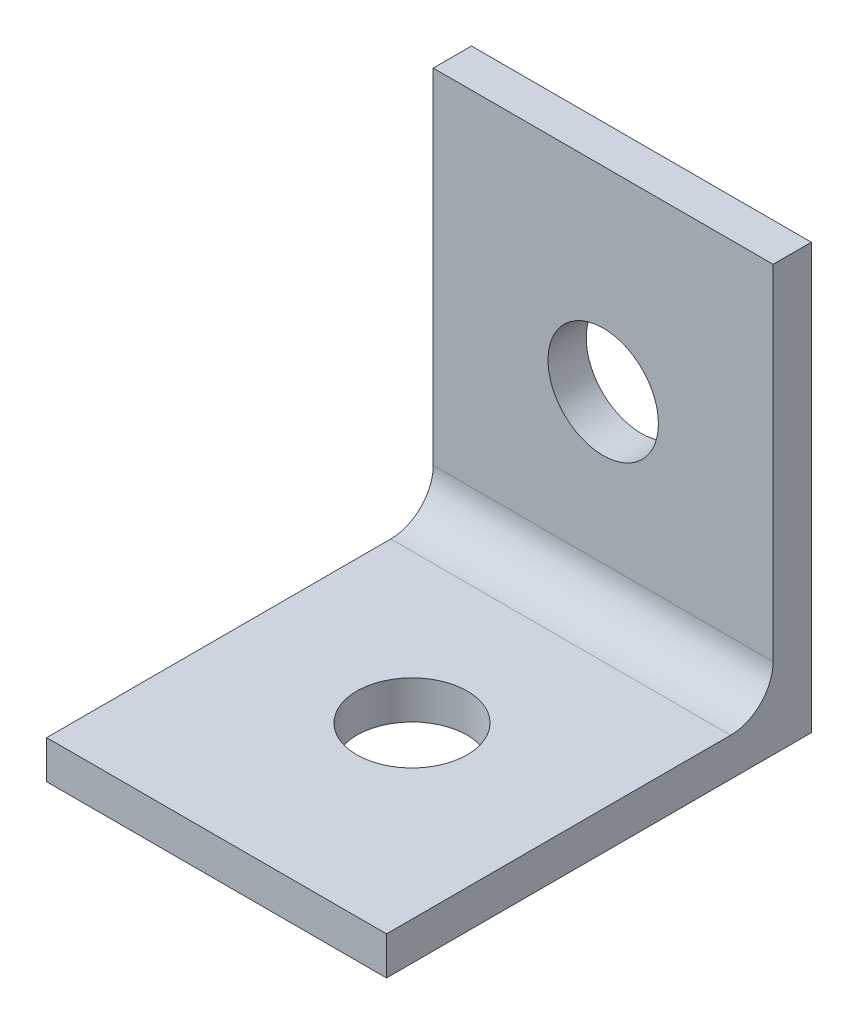
ISO-10303-21;
HEADER;
FILE_DESCRIPTION(('STEP AP214'),'2;1');
FILE_NAME('part.step','',(''),(''),'','','');
FILE_SCHEMA(('AUTOMOTIVE_DESIGN { 1 0 10303 214 1 1 1 1 }'));
ENDSEC;
DATA;
#1=APPLICATION_CONTEXT('core data for automotive mechanical design processes');
#2=APPLICATION_PROTOCOL_DEFINITION('international standard','automotive_design',2000,#1);
#3=PRODUCT_CONTEXT('',#1,'mechanical');
#4=PRODUCT('Part','Part','',(#3));
#5=PRODUCT_RELATED_PRODUCT_CATEGORY('part','',(#4));
#6=PRODUCT_DEFINITION_FORMATION('','',#4);
#7=PRODUCT_DEFINITION_CONTEXT('part definition',#1,'design');
#8=PRODUCT_DEFINITION('design','',#6,#7);
#9=PRODUCT_DEFINITION_SHAPE('','',#8);
#10=(LENGTH_UNIT() NAMED_UNIT(*) SI_UNIT(.MILLI.,.METRE.));
#11=(NAMED_UNIT(*) PLANE_ANGLE_UNIT() SI_UNIT($,.RADIAN.));
#12=(NAMED_UNIT(*) SI_UNIT($,.STERADIAN.) SOLID_ANGLE_UNIT());
#13=UNCERTAINTY_MEASURE_WITH_UNIT(LENGTH_MEASURE(1.E-05),#10,'distance_accuracy_value','');
#14=(GEOMETRIC_REPRESENTATION_CONTEXT(3) GLOBAL_UNCERTAINTY_ASSIGNED_CONTEXT((#13)) GLOBAL_UNIT_ASSIGNED_CONTEXT((#10,
#11,#12)) REPRESENTATION_CONTEXT('',''));
#15=CARTESIAN_POINT('',(0.,0.,0.));
#16=DIRECTION('',(0.,0.,1.));
#17=DIRECTION('',(1.,0.,0.));
#18=AXIS2_PLACEMENT_3D('',#15,#16,#17);
#19=CARTESIAN_POINT('',(0.,0.,1.8));
#20=DIRECTION('',(1.,0.,0.));
#21=DIRECTION('',(0.,0.,-1.));
#22=AXIS2_PLACEMENT_3D('',#19,#20,#21);
#23=PLANE('',#22);
#24=DIRECTION('',(0.,-1.,0.));
#25=VECTOR('',#24,1.);
#26=CARTESIAN_POINT('',(0.,0.,0.));
#27=LINE('',#26,#25);
#28=CARTESIAN_POINT('',(0.,20.,0.));
#29=VERTEX_POINT('',#28);
#30=CARTESIAN_POINT('',(0.,0.,0.));
#31=VERTEX_POINT('',#30);
#32=EDGE_CURVE('E131',#29,#31,#27,.T.);
#33=ORIENTED_EDGE('',*,*,#32,.T.);
#34=DIRECTION('',(0.,0.,-1.));
#35=VECTOR('',#34,1.);
#36=CARTESIAN_POINT('',(0.,0.,1.8));
#37=LINE('',#36,#35);
#38=CARTESIAN_POINT('',(0.,0.,20.));
#39=VERTEX_POINT('',#38);
#40=EDGE_CURVE('E166',#39,#31,#37,.T.);
#41=ORIENTED_EDGE('',*,*,#40,.F.);
#42=DIRECTION('',(0.,-1.,0.));
#43=VECTOR('',#42,1.);
#44=CARTESIAN_POINT('',(0.,1.8,20.));
#45=LINE('',#44,#43);
#46=CARTESIAN_POINT('',(0.,1.8,20.));
#47=VERTEX_POINT('',#46);
#48=EDGE_CURVE('E120',#47,#39,#45,.T.);
#49=ORIENTED_EDGE('',*,*,#48,.F.);
#50=DIRECTION('',(0.,0.,-1.));
#51=VECTOR('',#50,1.);
#52=CARTESIAN_POINT('',(0.,1.8,1.8));
#53=LINE('',#52,#51);
#54=CARTESIAN_POINT('',(0.,1.8,3.8));
#55=VERTEX_POINT('',#54);
#56=EDGE_CURVE('E111',#47,#55,#53,.T.);
#57=ORIENTED_EDGE('',*,*,#56,.T.);
#58=CARTESIAN_POINT('',(0.,3.8,3.8));
#59=DIRECTION('',(1.,0.,0.));
#60=DIRECTION('',(0.,0.,-1.));
#61=AXIS2_PLACEMENT_3D('',#58,#59,#60);
#62=CIRCLE('',#61,2.);
#63=CARTESIAN_POINT('',(0.,3.8,1.8));
#64=VERTEX_POINT('',#63);
#65=EDGE_CURVE('E11',#55,#64,#62,.T.);
#66=ORIENTED_EDGE('',*,*,#65,.T.);
#67=DIRECTION('',(0.,-1.,0.));
#68=VECTOR('',#67,1.);
#69=CARTESIAN_POINT('',(0.,0.,1.8));
#70=LINE('',#69,#68);
#71=CARTESIAN_POINT('',(0.,20.,1.8));
#72=VERTEX_POINT('',#71);
#73=EDGE_CURVE('E133',#72,#64,#70,.T.);
#74=ORIENTED_EDGE('',*,*,#73,.F.);
#75=DIRECTION('',(0.,0.,-1.));
#76=VECTOR('',#75,1.);
#77=CARTESIAN_POINT('',(0.,20.,1.8));
#78=LINE('',#77,#76);
#79=EDGE_CURVE('E144',#72,#29,#78,.T.);
#80=ORIENTED_EDGE('',*,*,#79,.T.);
#81=EDGE_LOOP('',(#33,#41,#49,#57,#66,#74,#80));
#82=FACE_BOUND('',#81,.T.);
#83=ADVANCED_FACE('F45',(#82),#23,.F.);
#84=CARTESIAN_POINT('',(0.,0.,1.8));
#85=DIRECTION('',(0.,1.,0.));
#86=DIRECTION('',(0.,0.,1.));
#87=AXIS2_PLACEMENT_3D('',#84,#85,#86);
#88=PLANE('',#87);
#89=CARTESIAN_POINT('',(8.,0.,10.8));
#90=DIRECTION('',(0.,1.,0.));
#91=DIRECTION('',(0.,0.,1.));
#92=AXIS2_PLACEMENT_3D('',#89,#90,#91);
#93=CIRCLE('',#92,2.6);
#94=CARTESIAN_POINT('',(8.,0.,13.4));
#95=VERTEX_POINT('',#94);
#96=EDGE_CURVE('E234',#95,#95,#93,.T.);
#97=ORIENTED_EDGE('',*,*,#96,.T.);
#98=EDGE_LOOP('',(#97));
#99=FACE_BOUND('',#98,.T.);
#100=DIRECTION('',(1.,0.,0.));
#101=VECTOR('',#100,1.);
#102=CARTESIAN_POINT('',(0.,0.,0.));
#103=LINE('',#102,#101);
#104=CARTESIAN_POINT('',(16.,0.,0.));
#105=VERTEX_POINT('',#104);
#106=EDGE_CURVE('E148',#31,#105,#103,.T.);
#107=ORIENTED_EDGE('',*,*,#106,.T.);
#108=DIRECTION('',(0.,0.,-1.));
#109=VECTOR('',#108,1.);
#110=CARTESIAN_POINT('',(16.,0.,1.8));
#111=LINE('',#110,#109);
#112=CARTESIAN_POINT('',(16.,0.,20.));
#113=VERTEX_POINT('',#112);
#114=EDGE_CURVE('E163',#113,#105,#111,.T.);
#115=ORIENTED_EDGE('',*,*,#114,.F.);
#116=DIRECTION('',(-1.,0.,0.));
#117=VECTOR('',#116,1.);
#118=CARTESIAN_POINT('',(0.,0.,20.));
#119=LINE('',#118,#117);
#120=EDGE_CURVE('E118',#113,#39,#119,.T.);
#121=ORIENTED_EDGE('',*,*,#120,.T.);
#122=ORIENTED_EDGE('',*,*,#40,.T.);
#123=EDGE_LOOP('',(#107,#115,#121,#122));
#124=FACE_BOUND('',#123,.T.);
#125=ADVANCED_FACE('F201',(#99,#124),#88,.F.);
#126=CARTESIAN_POINT('',(16.,0.,1.8));
#127=DIRECTION('',(-1.,0.,0.));
#128=DIRECTION('',(0.,0.,1.));
#129=AXIS2_PLACEMENT_3D('',#126,#127,#128);
#130=PLANE('',#129);
#131=DIRECTION('',(0.,1.,0.));
#132=VECTOR('',#131,1.);
#133=CARTESIAN_POINT('',(16.,0.,0.));
#134=LINE('',#133,#132);
#135=CARTESIAN_POINT('',(16.,20.,0.));
#136=VERTEX_POINT('',#135);
#137=EDGE_CURVE('E151',#105,#136,#134,.T.);
#138=ORIENTED_EDGE('',*,*,#137,.T.);
#139=DIRECTION('',(0.,0.,-1.));
#140=VECTOR('',#139,1.);
#141=CARTESIAN_POINT('',(16.,20.,1.8));
#142=LINE('',#141,#140);
#143=CARTESIAN_POINT('',(16.,20.,1.8));
#144=VERTEX_POINT('',#143);
#145=EDGE_CURVE('E159',#144,#136,#142,.T.);
#146=ORIENTED_EDGE('',*,*,#145,.F.);
#147=DIRECTION('',(0.,1.,0.));
#148=VECTOR('',#147,1.);
#149=CARTESIAN_POINT('',(16.,0.,1.8));
#150=LINE('',#149,#148);
#151=CARTESIAN_POINT('',(16.,3.8,1.8));
#152=VERTEX_POINT('',#151);
#153=EDGE_CURVE('E137',#152,#144,#150,.T.);
#154=ORIENTED_EDGE('',*,*,#153,.F.);
#155=CARTESIAN_POINT('',(16.,3.8,3.8));
#156=DIRECTION('',(-1.,0.,0.));
#157=DIRECTION('',(0.,0.,1.));
#158=AXIS2_PLACEMENT_3D('',#155,#156,#157);
#159=CIRCLE('',#158,2.);
#160=CARTESIAN_POINT('',(16.,1.8,3.8));
#161=VERTEX_POINT('',#160);
#162=EDGE_CURVE('E54',#152,#161,#159,.T.);
#163=ORIENTED_EDGE('',*,*,#162,.T.);
#164=DIRECTION('',(0.,0.,1.));
#165=VECTOR('',#164,1.);
#166=CARTESIAN_POINT('',(16.,1.8,1.8));
#167=LINE('',#166,#165);
#168=CARTESIAN_POINT('',(16.,1.8,20.));
#169=VERTEX_POINT('',#168);
#170=EDGE_CURVE('E102',#161,#169,#167,.T.);
#171=ORIENTED_EDGE('',*,*,#170,.T.);
#172=DIRECTION('',(0.,-1.,0.));
#173=VECTOR('',#172,1.);
#174=CARTESIAN_POINT('',(16.,1.8,20.));
#175=LINE('',#174,#173);
#176=EDGE_CURVE('E106',#169,#113,#175,.T.);
#177=ORIENTED_EDGE('',*,*,#176,.T.);
#178=ORIENTED_EDGE('',*,*,#114,.T.);
#179=EDGE_LOOP('',(#138,#146,#154,#163,#171,#177,#178));
#180=FACE_BOUND('',#179,.T.);
#181=ADVANCED_FACE('F104',(#180),#130,.F.);
#182=CARTESIAN_POINT('',(0.,20.,1.8));
#183=DIRECTION('',(0.,-1.,0.));
#184=DIRECTION('',(0.,0.,-1.));
#185=AXIS2_PLACEMENT_3D('',#182,#183,#184);
#186=PLANE('',#185);
#187=DIRECTION('',(-1.,0.,0.));
#188=VECTOR('',#187,1.);
#189=CARTESIAN_POINT('',(0.,20.,0.));
#190=LINE('',#189,#188);
#191=EDGE_CURVE('E138',#136,#29,#190,.T.);
#192=ORIENTED_EDGE('',*,*,#191,.T.);
#193=ORIENTED_EDGE('',*,*,#79,.F.);
#194=DIRECTION('',(-1.,0.,0.));
#195=VECTOR('',#194,1.);
#196=CARTESIAN_POINT('',(0.,20.,1.8));
#197=LINE('',#196,#195);
#198=EDGE_CURVE('E141',#144,#72,#197,.T.);
#199=ORIENTED_EDGE('',*,*,#198,.F.);
#200=ORIENTED_EDGE('',*,*,#145,.T.);
#201=EDGE_LOOP('',(#192,#193,#199,#200));
#202=FACE_BOUND('',#201,.T.);
#203=ADVANCED_FACE('F188',(#202),#186,.F.);
#204=CARTESIAN_POINT('',(0.,0.,1.8));
#205=DIRECTION('',(0.,0.,-1.));
#206=DIRECTION('',(-1.,0.,0.));
#207=AXIS2_PLACEMENT_3D('',#204,#205,#206);
#208=PLANE('',#207);
#209=CARTESIAN_POINT('',(8.,10.8,1.8));
#210=DIRECTION('',(0.,0.,1.));
#211=DIRECTION('',(1.,0.,0.));
#212=AXIS2_PLACEMENT_3D('',#209,#210,#211);
#213=CIRCLE('',#212,2.6);
#214=CARTESIAN_POINT('',(10.6,10.8,1.8));
#215=VERTEX_POINT('',#214);
#216=EDGE_CURVE('E232',#215,#215,#213,.T.);
#217=ORIENTED_EDGE('',*,*,#216,.F.);
#218=EDGE_LOOP('',(#217));
#219=FACE_BOUND('',#218,.T.);
#220=ORIENTED_EDGE('',*,*,#73,.T.);
#221=DIRECTION('',(1.,0.,0.));
#222=VECTOR('',#221,1.);
#223=CARTESIAN_POINT('',(0.,3.8,1.8));
#224=LINE('',#223,#222);
#225=EDGE_CURVE('E170',#64,#152,#224,.T.);
#226=ORIENTED_EDGE('',*,*,#225,.T.);
#227=ORIENTED_EDGE('',*,*,#153,.T.);
#228=ORIENTED_EDGE('',*,*,#198,.T.);
#229=EDGE_LOOP('',(#220,#226,#227,#228));
#230=FACE_BOUND('',#229,.T.);
#231=ADVANCED_FACE('F178',(#219,#230),#208,.F.);
#232=CARTESIAN_POINT('',(0.,0.,0.));
#233=DIRECTION('',(0.,0.,-1.));
#234=DIRECTION('',(-1.,0.,0.));
#235=AXIS2_PLACEMENT_3D('',#232,#233,#234);
#236=PLANE('',#235);
#237=CARTESIAN_POINT('',(8.,10.8,0.));
#238=DIRECTION('',(0.,0.,1.));
#239=DIRECTION('',(1.,0.,0.));
#240=AXIS2_PLACEMENT_3D('',#237,#238,#239);
#241=CIRCLE('',#240,2.6);
#242=CARTESIAN_POINT('',(10.6,10.8,0.));
#243=VERTEX_POINT('',#242);
#244=EDGE_CURVE('E129',#243,#243,#241,.T.);
#245=ORIENTED_EDGE('',*,*,#244,.T.);
#246=EDGE_LOOP('',(#245));
#247=FACE_BOUND('',#246,.T.);
#248=ORIENTED_EDGE('',*,*,#32,.F.);
#249=ORIENTED_EDGE('',*,*,#191,.F.);
#250=ORIENTED_EDGE('',*,*,#137,.F.);
#251=ORIENTED_EDGE('',*,*,#106,.F.);
#252=EDGE_LOOP('',(#248,#249,#250,#251));
#253=FACE_BOUND('',#252,.T.);
#254=ADVANCED_FACE('F212',(#247,#253),#236,.T.);
#255=CARTESIAN_POINT('',(0.,1.8,20.));
#256=DIRECTION('',(0.,0.,1.));
#257=DIRECTION('',(1.,0.,0.));
#258=AXIS2_PLACEMENT_3D('',#255,#256,#257);
#259=PLANE('',#258);
#260=ORIENTED_EDGE('',*,*,#120,.F.);
#261=ORIENTED_EDGE('',*,*,#176,.F.);
#262=DIRECTION('',(-1.,0.,0.));
#263=VECTOR('',#262,1.);
#264=CARTESIAN_POINT('',(0.,1.8,20.));
#265=LINE('',#264,#263);
#266=EDGE_CURVE('E110',#169,#47,#265,.T.);
#267=ORIENTED_EDGE('',*,*,#266,.T.);
#268=ORIENTED_EDGE('',*,*,#48,.T.);
#269=EDGE_LOOP('',(#260,#261,#267,#268));
#270=FACE_BOUND('',#269,.T.);
#271=ADVANCED_FACE('F115',(#270),#259,.T.);
#272=CARTESIAN_POINT('',(0.,1.8,0.));
#273=DIRECTION('',(0.,1.,0.));
#274=DIRECTION('',(0.,0.,1.));
#275=AXIS2_PLACEMENT_3D('',#272,#273,#274);
#276=PLANE('',#275);
#277=CARTESIAN_POINT('',(8.,1.8,10.8));
#278=DIRECTION('',(0.,1.,0.));
#279=DIRECTION('',(0.,0.,1.));
#280=AXIS2_PLACEMENT_3D('',#277,#278,#279);
#281=CIRCLE('',#280,2.6);
#282=CARTESIAN_POINT('',(8.,1.8,13.4));
#283=VERTEX_POINT('',#282);
#284=EDGE_CURVE('E240',#283,#283,#281,.T.);
#285=ORIENTED_EDGE('',*,*,#284,.F.);
#286=EDGE_LOOP('',(#285));
#287=FACE_BOUND('',#286,.T.);
#288=ORIENTED_EDGE('',*,*,#170,.F.);
#289=DIRECTION('',(1.,0.,0.));
#290=VECTOR('',#289,1.);
#291=CARTESIAN_POINT('',(0.,1.8,3.8));
#292=LINE('',#291,#290);
#293=EDGE_CURVE('E67',#161,#55,#292,.F.);
#294=ORIENTED_EDGE('',*,*,#293,.T.);
#295=ORIENTED_EDGE('',*,*,#56,.F.);
#296=ORIENTED_EDGE('',*,*,#266,.F.);
#297=EDGE_LOOP('',(#288,#294,#295,#296));
#298=FACE_BOUND('',#297,.T.);
#299=ADVANCED_FACE('F122',(#287,#298),#276,.T.);
#300=CARTESIAN_POINT('',(8.,10.8,0.));
#301=DIRECTION('',(0.,0.,1.));
#302=DIRECTION('',(1.,0.,0.));
#303=AXIS2_PLACEMENT_3D('',#300,#301,#302);
#304=CYLINDRICAL_SURFACE('',#303,2.6);
#305=ORIENTED_EDGE('',*,*,#244,.F.);
#306=EDGE_LOOP('',(#305));
#307=FACE_BOUND('',#306,.T.);
#308=ORIENTED_EDGE('',*,*,#216,.T.);
#309=EDGE_LOOP('',(#308));
#310=FACE_BOUND('',#309,.T.);
#311=ADVANCED_FACE('F197',(#307,#310),#304,.F.);
#312=CARTESIAN_POINT('',(8.,0.,10.8));
#313=DIRECTION('',(0.,1.,0.));
#314=DIRECTION('',(0.,0.,1.));
#315=AXIS2_PLACEMENT_3D('',#312,#313,#314);
#316=CYLINDRICAL_SURFACE('',#315,2.6);
#317=ORIENTED_EDGE('',*,*,#96,.F.);
#318=EDGE_LOOP('',(#317));
#319=FACE_BOUND('',#318,.T.);
#320=ORIENTED_EDGE('',*,*,#284,.T.);
#321=EDGE_LOOP('',(#320));
#322=FACE_BOUND('',#321,.T.);
#323=ADVANCED_FACE('F192',(#319,#322),#316,.F.);
#324=CARTESIAN_POINT('',(0.,3.8,3.8));
#325=DIRECTION('',(1.,0.,0.));
#326=DIRECTION('',(0.,0.,-1.));
#327=AXIS2_PLACEMENT_3D('',#324,#325,#326);
#328=CYLINDRICAL_SURFACE('',#327,2.);
#329=ORIENTED_EDGE('',*,*,#65,.F.);
#330=ORIENTED_EDGE('',*,*,#293,.F.);
#331=ORIENTED_EDGE('',*,*,#162,.F.);
#332=ORIENTED_EDGE('',*,*,#225,.F.);
#333=EDGE_LOOP('',(#329,#330,#331,#332));
#334=FACE_BOUND('',#333,.T.);
#335=ADVANCED_FACE('F47',(#334),#328,.F.);
#336=CLOSED_SHELL('',(#83,#125,#181,#203,#231,#254,#271,#299,#311,#323,#335));
#337=MANIFOLD_SOLID_BREP('B2',#336);
#338=ADVANCED_BREP_SHAPE_REPRESENTATION('',(#18,#337),#14);
#339=SHAPE_DEFINITION_REPRESENTATION(#9,#338);
ENDSEC;
END-ISO-10303-21;
